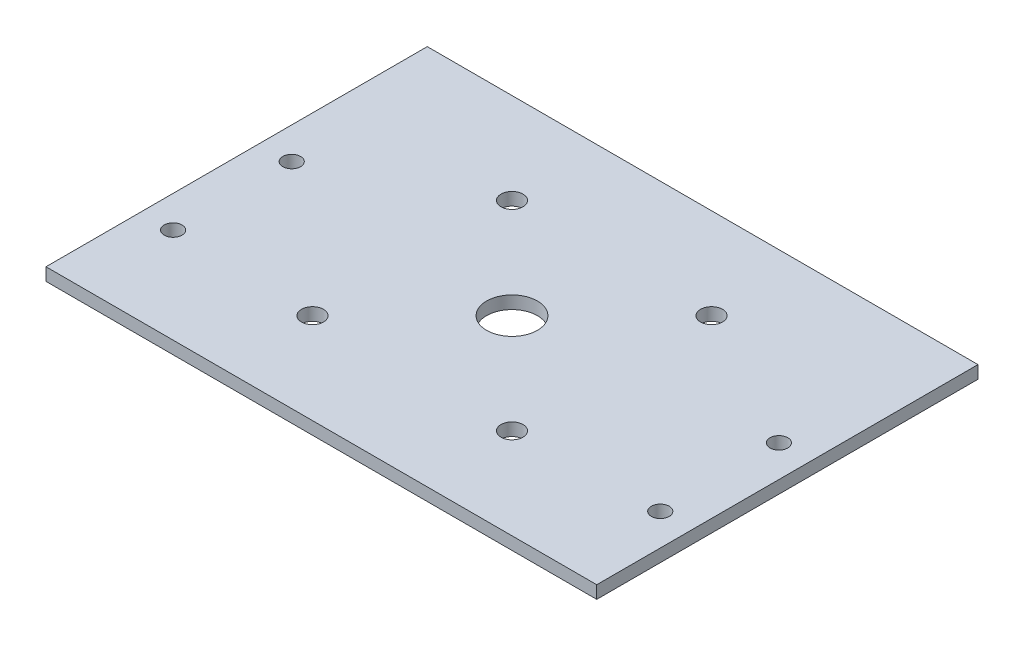
ISO-10303-21;
HEADER;
FILE_DESCRIPTION(('STEP AP214'),'2;1');
FILE_NAME('part.step','',(''),(''),'','','');
FILE_SCHEMA(('AUTOMOTIVE_DESIGN { 1 0 10303 214 1 1 1 1 }'));
ENDSEC;
DATA;
#1=APPLICATION_CONTEXT('core data for automotive mechanical design processes');
#2=APPLICATION_PROTOCOL_DEFINITION('international standard','automotive_design',2000,#1);
#3=PRODUCT_CONTEXT('',#1,'mechanical');
#4=PRODUCT('Part','Part','',(#3));
#5=PRODUCT_RELATED_PRODUCT_CATEGORY('part','',(#4));
#6=PRODUCT_DEFINITION_FORMATION('','',#4);
#7=PRODUCT_DEFINITION_CONTEXT('part definition',#1,'design');
#8=PRODUCT_DEFINITION('design','',#6,#7);
#9=PRODUCT_DEFINITION_SHAPE('','',#8);
#10=(LENGTH_UNIT() NAMED_UNIT(*) SI_UNIT(.MILLI.,.METRE.));
#11=(NAMED_UNIT(*) PLANE_ANGLE_UNIT() SI_UNIT($,.RADIAN.));
#12=(NAMED_UNIT(*) SI_UNIT($,.STERADIAN.) SOLID_ANGLE_UNIT());
#13=UNCERTAINTY_MEASURE_WITH_UNIT(LENGTH_MEASURE(1.E-05),#10,'distance_accuracy_value','');
#14=(GEOMETRIC_REPRESENTATION_CONTEXT(3) GLOBAL_UNCERTAINTY_ASSIGNED_CONTEXT((#13)) GLOBAL_UNIT_ASSIGNED_CONTEXT((#10,
#11,#12)) REPRESENTATION_CONTEXT('',''));
#15=CARTESIAN_POINT('',(0.,0.,0.));
#16=DIRECTION('',(0.,0.,1.));
#17=DIRECTION('',(1.,0.,0.));
#18=AXIS2_PLACEMENT_3D('',#15,#16,#17);
#19=CARTESIAN_POINT('',(65.,3.,-45.));
#20=DIRECTION('',(-1.,0.,0.));
#21=DIRECTION('',(0.,0.,1.));
#22=AXIS2_PLACEMENT_3D('',#19,#20,#21);
#23=PLANE('',#22);
#24=DIRECTION('',(0.,0.,-1.));
#25=VECTOR('',#24,1.);
#26=CARTESIAN_POINT('',(65.,0.,-45.));
#27=LINE('',#26,#25);
#28=CARTESIAN_POINT('',(65.,0.,45.));
#29=VERTEX_POINT('',#28);
#30=CARTESIAN_POINT('',(65.,0.,-45.));
#31=VERTEX_POINT('',#30);
#32=EDGE_CURVE('E111',#29,#31,#27,.T.);
#33=ORIENTED_EDGE('',*,*,#32,.T.);
#34=DIRECTION('',(0.,-1.,0.));
#35=VECTOR('',#34,1.);
#36=CARTESIAN_POINT('',(65.,3.,-45.));
#37=LINE('',#36,#35);
#38=CARTESIAN_POINT('',(65.,3.,-45.));
#39=VERTEX_POINT('',#38);
#40=EDGE_CURVE('E13',#39,#31,#37,.T.);
#41=ORIENTED_EDGE('',*,*,#40,.F.);
#42=DIRECTION('',(0.,0.,-1.));
#43=VECTOR('',#42,1.);
#44=CARTESIAN_POINT('',(65.,3.,-45.));
#45=LINE('',#44,#43);
#46=CARTESIAN_POINT('',(65.,3.,45.));
#47=VERTEX_POINT('',#46);
#48=EDGE_CURVE('E98',#47,#39,#45,.T.);
#49=ORIENTED_EDGE('',*,*,#48,.F.);
#50=DIRECTION('',(0.,-1.,0.));
#51=VECTOR('',#50,1.);
#52=CARTESIAN_POINT('',(65.,3.,45.));
#53=LINE('',#52,#51);
#54=EDGE_CURVE('E107',#47,#29,#53,.T.);
#55=ORIENTED_EDGE('',*,*,#54,.T.);
#56=EDGE_LOOP('',(#33,#41,#49,#55));
#57=FACE_BOUND('',#56,.T.);
#58=ADVANCED_FACE('F45',(#57),#23,.F.);
#59=CARTESIAN_POINT('',(-65.,3.,-45.));
#60=DIRECTION('',(0.,0.,1.));
#61=DIRECTION('',(1.,0.,0.));
#62=AXIS2_PLACEMENT_3D('',#59,#60,#61);
#63=PLANE('',#62);
#64=DIRECTION('',(-1.,0.,0.));
#65=VECTOR('',#64,1.);
#66=CARTESIAN_POINT('',(-65.,0.,-45.));
#67=LINE('',#66,#65);
#68=CARTESIAN_POINT('',(-65.,0.,-45.));
#69=VERTEX_POINT('',#68);
#70=EDGE_CURVE('E102',#31,#69,#67,.T.);
#71=ORIENTED_EDGE('',*,*,#70,.T.);
#72=DIRECTION('',(0.,-1.,0.));
#73=VECTOR('',#72,1.);
#74=CARTESIAN_POINT('',(-65.,3.,-45.));
#75=LINE('',#74,#73);
#76=CARTESIAN_POINT('',(-65.,3.,-45.));
#77=VERTEX_POINT('',#76);
#78=EDGE_CURVE('E54',#77,#69,#75,.T.);
#79=ORIENTED_EDGE('',*,*,#78,.F.);
#80=DIRECTION('',(-1.,0.,0.));
#81=VECTOR('',#80,1.);
#82=CARTESIAN_POINT('',(-65.,3.,-45.));
#83=LINE('',#82,#81);
#84=EDGE_CURVE('E93',#39,#77,#83,.T.);
#85=ORIENTED_EDGE('',*,*,#84,.F.);
#86=ORIENTED_EDGE('',*,*,#40,.T.);
#87=EDGE_LOOP('',(#71,#79,#85,#86));
#88=FACE_BOUND('',#87,.T.);
#89=ADVANCED_FACE('F101',(#88),#63,.F.);
#90=CARTESIAN_POINT('',(-65.,3.,-45.));
#91=DIRECTION('',(1.,0.,0.));
#92=DIRECTION('',(0.,0.,-1.));
#93=AXIS2_PLACEMENT_3D('',#90,#91,#92);
#94=PLANE('',#93);
#95=DIRECTION('',(0.,0.,1.));
#96=VECTOR('',#95,1.);
#97=CARTESIAN_POINT('',(-65.,0.,-45.));
#98=LINE('',#97,#96);
#99=CARTESIAN_POINT('',(-65.,0.,45.));
#100=VERTEX_POINT('',#99);
#101=EDGE_CURVE('E80',#69,#100,#98,.T.);
#102=ORIENTED_EDGE('',*,*,#101,.T.);
#103=DIRECTION('',(0.,-1.,0.));
#104=VECTOR('',#103,1.);
#105=CARTESIAN_POINT('',(-65.,3.,45.));
#106=LINE('',#105,#104);
#107=CARTESIAN_POINT('',(-65.,3.,45.));
#108=VERTEX_POINT('',#107);
#109=EDGE_CURVE('E103',#108,#100,#106,.T.);
#110=ORIENTED_EDGE('',*,*,#109,.F.);
#111=DIRECTION('',(0.,0.,1.));
#112=VECTOR('',#111,1.);
#113=CARTESIAN_POINT('',(-65.,3.,-45.));
#114=LINE('',#113,#112);
#115=EDGE_CURVE('E96',#77,#108,#114,.T.);
#116=ORIENTED_EDGE('',*,*,#115,.F.);
#117=ORIENTED_EDGE('',*,*,#78,.T.);
#118=EDGE_LOOP('',(#102,#110,#116,#117));
#119=FACE_BOUND('',#118,.T.);
#120=ADVANCED_FACE('F105',(#119),#94,.F.);
#121=CARTESIAN_POINT('',(-65.,3.,45.));
#122=DIRECTION('',(0.,0.,-1.));
#123=DIRECTION('',(-1.,0.,0.));
#124=AXIS2_PLACEMENT_3D('',#121,#122,#123);
#125=PLANE('',#124);
#126=DIRECTION('',(1.,0.,0.));
#127=VECTOR('',#126,1.);
#128=CARTESIAN_POINT('',(-65.,0.,45.));
#129=LINE('',#128,#127);
#130=EDGE_CURVE('E86',#100,#29,#129,.T.);
#131=ORIENTED_EDGE('',*,*,#130,.T.);
#132=ORIENTED_EDGE('',*,*,#54,.F.);
#133=DIRECTION('',(1.,0.,0.));
#134=VECTOR('',#133,1.);
#135=CARTESIAN_POINT('',(-65.,3.,45.));
#136=LINE('',#135,#134);
#137=EDGE_CURVE('E63',#108,#47,#136,.T.);
#138=ORIENTED_EDGE('',*,*,#137,.F.);
#139=ORIENTED_EDGE('',*,*,#109,.T.);
#140=EDGE_LOOP('',(#131,#132,#138,#139));
#141=FACE_BOUND('',#140,.T.);
#142=ADVANCED_FACE('F150',(#141),#125,.F.);
#143=CARTESIAN_POINT('',(0.,3.,0.));
#144=DIRECTION('',(0.,1.,0.));
#145=DIRECTION('',(0.,0.,1.));
#146=AXIS2_PLACEMENT_3D('',#143,#144,#145);
#147=PLANE('',#146);
#148=CARTESIAN_POINT('',(0.,3.,0.));
#149=DIRECTION('',(0.,1.,0.));
#150=DIRECTION('',(0.,0.,1.));
#151=AXIS2_PLACEMENT_3D('',#148,#149,#150);
#152=CIRCLE('',#151,6.);
#153=CARTESIAN_POINT('',(0.,3.,6.));
#154=VERTEX_POINT('',#153);
#155=EDGE_CURVE('E282',#154,#154,#152,.T.);
#156=ORIENTED_EDGE('',*,*,#155,.F.);
#157=EDGE_LOOP('',(#156));
#158=FACE_BOUND('',#157,.T.);
#159=CARTESIAN_POINT('',(57.5,3.,-5.50000000000005));
#160=DIRECTION('',(0.,1.,0.));
#161=DIRECTION('',(0.,0.,1.));
#162=AXIS2_PLACEMENT_3D('',#159,#160,#161);
#163=CIRCLE('',#162,2.1);
#164=CARTESIAN_POINT('',(57.5,3.,-3.40000000000005));
#165=VERTEX_POINT('',#164);
#166=EDGE_CURVE('E292',#165,#165,#163,.T.);
#167=ORIENTED_EDGE('',*,*,#166,.F.);
#168=EDGE_LOOP('',(#167));
#169=FACE_BOUND('',#168,.T.);
#170=CARTESIAN_POINT('',(-57.5,3.,-5.50000000000005));
#171=DIRECTION('',(0.,1.,0.));
#172=DIRECTION('',(0.,0.,1.));
#173=AXIS2_PLACEMENT_3D('',#170,#171,#172);
#174=CIRCLE('',#173,2.1);
#175=CARTESIAN_POINT('',(-57.5,3.,-3.40000000000005));
#176=VERTEX_POINT('',#175);
#177=EDGE_CURVE('E298',#176,#176,#174,.T.);
#178=ORIENTED_EDGE('',*,*,#177,.F.);
#179=EDGE_LOOP('',(#178));
#180=FACE_BOUND('',#179,.T.);
#181=CARTESIAN_POINT('',(-57.5,3.,22.4999999999995));
#182=DIRECTION('',(0.,1.,0.));
#183=DIRECTION('',(0.,0.,1.));
#184=AXIS2_PLACEMENT_3D('',#181,#182,#183);
#185=CIRCLE('',#184,2.1);
#186=CARTESIAN_POINT('',(-57.5,3.,24.5999999999995));
#187=VERTEX_POINT('',#186);
#188=EDGE_CURVE('E304',#187,#187,#185,.T.);
#189=ORIENTED_EDGE('',*,*,#188,.F.);
#190=EDGE_LOOP('',(#189));
#191=FACE_BOUND('',#190,.T.);
#192=CARTESIAN_POINT('',(57.5,3.,22.4999999999995));
#193=DIRECTION('',(0.,1.,0.));
#194=DIRECTION('',(0.,0.,1.));
#195=AXIS2_PLACEMENT_3D('',#192,#193,#194);
#196=CIRCLE('',#195,2.1);
#197=CARTESIAN_POINT('',(57.5,3.,24.5999999999995));
#198=VERTEX_POINT('',#197);
#199=EDGE_CURVE('E309',#198,#198,#196,.T.);
#200=ORIENTED_EDGE('',*,*,#199,.F.);
#201=EDGE_LOOP('',(#200));
#202=FACE_BOUND('',#201,.T.);
#203=CARTESIAN_POINT('',(23.55,3.,-23.55));
#204=DIRECTION('',(0.,1.,0.));
#205=DIRECTION('',(0.,0.,1.));
#206=AXIS2_PLACEMENT_3D('',#203,#204,#205);
#207=CIRCLE('',#206,2.6);
#208=CARTESIAN_POINT('',(23.55,3.,-20.95));
#209=VERTEX_POINT('',#208);
#210=EDGE_CURVE('E138',#209,#209,#207,.T.);
#211=ORIENTED_EDGE('',*,*,#210,.F.);
#212=EDGE_LOOP('',(#211));
#213=FACE_BOUND('',#212,.T.);
#214=CARTESIAN_POINT('',(-23.55,3.,-23.55));
#215=DIRECTION('',(0.,1.,0.));
#216=DIRECTION('',(0.,0.,1.));
#217=AXIS2_PLACEMENT_3D('',#214,#215,#216);
#218=CIRCLE('',#217,2.6);
#219=CARTESIAN_POINT('',(-23.55,3.,-20.95));
#220=VERTEX_POINT('',#219);
#221=EDGE_CURVE('E128',#220,#220,#218,.T.);
#222=ORIENTED_EDGE('',*,*,#221,.F.);
#223=EDGE_LOOP('',(#222));
#224=FACE_BOUND('',#223,.T.);
#225=CARTESIAN_POINT('',(-23.55,3.,23.55));
#226=DIRECTION('',(0.,1.,0.));
#227=DIRECTION('',(0.,0.,1.));
#228=AXIS2_PLACEMENT_3D('',#225,#226,#227);
#229=CIRCLE('',#228,2.6);
#230=CARTESIAN_POINT('',(-23.55,3.,26.15));
#231=VERTEX_POINT('',#230);
#232=EDGE_CURVE('E125',#231,#231,#229,.T.);
#233=ORIENTED_EDGE('',*,*,#232,.F.);
#234=EDGE_LOOP('',(#233));
#235=FACE_BOUND('',#234,.T.);
#236=CARTESIAN_POINT('',(23.55,3.,23.55));
#237=DIRECTION('',(0.,1.,0.));
#238=DIRECTION('',(0.,0.,1.));
#239=AXIS2_PLACEMENT_3D('',#236,#237,#238);
#240=CIRCLE('',#239,2.6);
#241=CARTESIAN_POINT('',(23.55,3.,26.15));
#242=VERTEX_POINT('',#241);
#243=EDGE_CURVE('E122',#242,#242,#240,.T.);
#244=ORIENTED_EDGE('',*,*,#243,.F.);
#245=EDGE_LOOP('',(#244));
#246=FACE_BOUND('',#245,.T.);
#247=ORIENTED_EDGE('',*,*,#48,.T.);
#248=ORIENTED_EDGE('',*,*,#84,.T.);
#249=ORIENTED_EDGE('',*,*,#115,.T.);
#250=ORIENTED_EDGE('',*,*,#137,.T.);
#251=EDGE_LOOP('',(#247,#248,#249,#250));
#252=FACE_BOUND('',#251,.T.);
#253=ADVANCED_FACE('F94',(#158,#169,#180,#191,#202,#213,#224,#235,#246,#252),#147,.T.);
#254=CARTESIAN_POINT('',(0.,0.,0.));
#255=DIRECTION('',(0.,1.,0.));
#256=DIRECTION('',(0.,0.,1.));
#257=AXIS2_PLACEMENT_3D('',#254,#255,#256);
#258=PLANE('',#257);
#259=CARTESIAN_POINT('',(0.,0.,0.));
#260=DIRECTION('',(0.,-1.,0.));
#261=DIRECTION('',(0.,0.,-1.));
#262=AXIS2_PLACEMENT_3D('',#259,#260,#261);
#263=CIRCLE('',#262,6.);
#264=CARTESIAN_POINT('',(0.,0.,-6.));
#265=VERTEX_POINT('',#264);
#266=EDGE_CURVE('E285',#265,#265,#263,.T.);
#267=ORIENTED_EDGE('',*,*,#266,.F.);
#268=EDGE_LOOP('',(#267));
#269=FACE_BOUND('',#268,.T.);
#270=CARTESIAN_POINT('',(57.5,0.,-5.50000000000005));
#271=DIRECTION('',(0.,-1.,0.));
#272=DIRECTION('',(0.,0.,-1.));
#273=AXIS2_PLACEMENT_3D('',#270,#271,#272);
#274=CIRCLE('',#273,2.1);
#275=CARTESIAN_POINT('',(57.5,0.,-7.60000000000004));
#276=VERTEX_POINT('',#275);
#277=EDGE_CURVE('E287',#276,#276,#274,.T.);
#278=ORIENTED_EDGE('',*,*,#277,.F.);
#279=EDGE_LOOP('',(#278));
#280=FACE_BOUND('',#279,.T.);
#281=CARTESIAN_POINT('',(-57.5,0.,-5.50000000000005));
#282=DIRECTION('',(0.,-1.,0.));
#283=DIRECTION('',(0.,0.,-1.));
#284=AXIS2_PLACEMENT_3D('',#281,#282,#283);
#285=CIRCLE('',#284,2.1);
#286=CARTESIAN_POINT('',(-57.5,0.,-7.60000000000004));
#287=VERTEX_POINT('',#286);
#288=EDGE_CURVE('E295',#287,#287,#285,.T.);
#289=ORIENTED_EDGE('',*,*,#288,.F.);
#290=EDGE_LOOP('',(#289));
#291=FACE_BOUND('',#290,.T.);
#292=CARTESIAN_POINT('',(-57.5,0.,22.4999999999995));
#293=DIRECTION('',(0.,-1.,0.));
#294=DIRECTION('',(0.,0.,-1.));
#295=AXIS2_PLACEMENT_3D('',#292,#293,#294);
#296=CIRCLE('',#295,2.1);
#297=CARTESIAN_POINT('',(-57.5,0.,20.3999999999995));
#298=VERTEX_POINT('',#297);
#299=EDGE_CURVE('E301',#298,#298,#296,.T.);
#300=ORIENTED_EDGE('',*,*,#299,.F.);
#301=EDGE_LOOP('',(#300));
#302=FACE_BOUND('',#301,.T.);
#303=CARTESIAN_POINT('',(57.5,0.,22.4999999999995));
#304=DIRECTION('',(0.,-1.,0.));
#305=DIRECTION('',(0.,0.,-1.));
#306=AXIS2_PLACEMENT_3D('',#303,#304,#305);
#307=CIRCLE('',#306,2.1);
#308=CARTESIAN_POINT('',(57.5,0.,20.3999999999995));
#309=VERTEX_POINT('',#308);
#310=EDGE_CURVE('E307',#309,#309,#307,.T.);
#311=ORIENTED_EDGE('',*,*,#310,.F.);
#312=EDGE_LOOP('',(#311));
#313=FACE_BOUND('',#312,.T.);
#314=CARTESIAN_POINT('',(23.55,0.,-23.55));
#315=DIRECTION('',(0.,1.,0.));
#316=DIRECTION('',(0.,0.,1.));
#317=AXIS2_PLACEMENT_3D('',#314,#315,#316);
#318=CIRCLE('',#317,2.6);
#319=CARTESIAN_POINT('',(23.55,0.,-20.95));
#320=VERTEX_POINT('',#319);
#321=EDGE_CURVE('E48',#320,#320,#318,.T.);
#322=ORIENTED_EDGE('',*,*,#321,.T.);
#323=EDGE_LOOP('',(#322));
#324=FACE_BOUND('',#323,.T.);
#325=CARTESIAN_POINT('',(-23.55,0.,-23.55));
#326=DIRECTION('',(0.,1.,0.));
#327=DIRECTION('',(0.,0.,1.));
#328=AXIS2_PLACEMENT_3D('',#325,#326,#327);
#329=CIRCLE('',#328,2.6);
#330=CARTESIAN_POINT('',(-23.55,0.,-20.95));
#331=VERTEX_POINT('',#330);
#332=EDGE_CURVE('E126',#331,#331,#329,.T.);
#333=ORIENTED_EDGE('',*,*,#332,.T.);
#334=EDGE_LOOP('',(#333));
#335=FACE_BOUND('',#334,.T.);
#336=CARTESIAN_POINT('',(-23.55,0.,23.55));
#337=DIRECTION('',(0.,1.,0.));
#338=DIRECTION('',(0.,0.,1.));
#339=AXIS2_PLACEMENT_3D('',#336,#337,#338);
#340=CIRCLE('',#339,2.6);
#341=CARTESIAN_POINT('',(-23.55,0.,26.15));
#342=VERTEX_POINT('',#341);
#343=EDGE_CURVE('E123',#342,#342,#340,.T.);
#344=ORIENTED_EDGE('',*,*,#343,.T.);
#345=EDGE_LOOP('',(#344));
#346=FACE_BOUND('',#345,.T.);
#347=CARTESIAN_POINT('',(23.55,0.,23.55));
#348=DIRECTION('',(0.,1.,0.));
#349=DIRECTION('',(0.,0.,1.));
#350=AXIS2_PLACEMENT_3D('',#347,#348,#349);
#351=CIRCLE('',#350,2.6);
#352=CARTESIAN_POINT('',(23.55,0.,26.15));
#353=VERTEX_POINT('',#352);
#354=EDGE_CURVE('E114',#353,#353,#351,.T.);
#355=ORIENTED_EDGE('',*,*,#354,.T.);
#356=EDGE_LOOP('',(#355));
#357=FACE_BOUND('',#356,.T.);
#358=ORIENTED_EDGE('',*,*,#32,.F.);
#359=ORIENTED_EDGE('',*,*,#130,.F.);
#360=ORIENTED_EDGE('',*,*,#101,.F.);
#361=ORIENTED_EDGE('',*,*,#70,.F.);
#362=EDGE_LOOP('',(#358,#359,#360,#361));
#363=FACE_BOUND('',#362,.T.);
#364=ADVANCED_FACE('F149',(#269,#280,#291,#302,#313,#324,#335,#346,#357,#363),#258,.F.);
#365=CARTESIAN_POINT('',(23.55,-7.,23.55));
#366=DIRECTION('',(0.,1.,0.));
#367=DIRECTION('',(0.,0.,1.));
#368=AXIS2_PLACEMENT_3D('',#365,#366,#367);
#369=CYLINDRICAL_SURFACE('',#368,2.6);
#370=ORIENTED_EDGE('',*,*,#243,.T.);
#371=EDGE_LOOP('',(#370));
#372=FACE_BOUND('',#371,.T.);
#373=ORIENTED_EDGE('',*,*,#354,.F.);
#374=EDGE_LOOP('',(#373));
#375=FACE_BOUND('',#374,.T.);
#376=ADVANCED_FACE('F145',(#372,#375),#369,.F.);
#377=CARTESIAN_POINT('',(-23.55,-7.,23.55));
#378=DIRECTION('',(0.,1.,0.));
#379=DIRECTION('',(0.,0.,1.));
#380=AXIS2_PLACEMENT_3D('',#377,#378,#379);
#381=CYLINDRICAL_SURFACE('',#380,2.6);
#382=ORIENTED_EDGE('',*,*,#232,.T.);
#383=EDGE_LOOP('',(#382));
#384=FACE_BOUND('',#383,.T.);
#385=ORIENTED_EDGE('',*,*,#343,.F.);
#386=EDGE_LOOP('',(#385));
#387=FACE_BOUND('',#386,.T.);
#388=ADVANCED_FACE('F190',(#384,#387),#381,.F.);
#389=CARTESIAN_POINT('',(-23.55,-7.,-23.55));
#390=DIRECTION('',(0.,1.,0.));
#391=DIRECTION('',(0.,0.,1.));
#392=AXIS2_PLACEMENT_3D('',#389,#390,#391);
#393=CYLINDRICAL_SURFACE('',#392,2.6);
#394=ORIENTED_EDGE('',*,*,#221,.T.);
#395=EDGE_LOOP('',(#394));
#396=FACE_BOUND('',#395,.T.);
#397=ORIENTED_EDGE('',*,*,#332,.F.);
#398=EDGE_LOOP('',(#397));
#399=FACE_BOUND('',#398,.T.);
#400=ADVANCED_FACE('F199',(#396,#399),#393,.F.);
#401=CARTESIAN_POINT('',(23.55,-7.,-23.55));
#402=DIRECTION('',(0.,1.,0.));
#403=DIRECTION('',(0.,0.,1.));
#404=AXIS2_PLACEMENT_3D('',#401,#402,#403);
#405=CYLINDRICAL_SURFACE('',#404,2.6);
#406=ORIENTED_EDGE('',*,*,#210,.T.);
#407=EDGE_LOOP('',(#406));
#408=FACE_BOUND('',#407,.T.);
#409=ORIENTED_EDGE('',*,*,#321,.F.);
#410=EDGE_LOOP('',(#409));
#411=FACE_BOUND('',#410,.T.);
#412=ADVANCED_FACE('F209',(#408,#411),#405,.F.);
#413=CARTESIAN_POINT('',(57.5,10.,22.4999999999995));
#414=DIRECTION('',(0.,-1.,0.));
#415=DIRECTION('',(0.,0.,-1.));
#416=AXIS2_PLACEMENT_3D('',#413,#414,#415);
#417=CYLINDRICAL_SURFACE('',#416,2.1);
#418=ORIENTED_EDGE('',*,*,#199,.T.);
#419=EDGE_LOOP('',(#418));
#420=FACE_BOUND('',#419,.T.);
#421=ORIENTED_EDGE('',*,*,#310,.T.);
#422=EDGE_LOOP('',(#421));
#423=FACE_BOUND('',#422,.T.);
#424=ADVANCED_FACE('F218',(#420,#423),#417,.F.);
#425=CARTESIAN_POINT('',(-57.5,10.,22.4999999999995));
#426=DIRECTION('',(0.,-1.,0.));
#427=DIRECTION('',(0.,0.,-1.));
#428=AXIS2_PLACEMENT_3D('',#425,#426,#427);
#429=CYLINDRICAL_SURFACE('',#428,2.1);
#430=ORIENTED_EDGE('',*,*,#188,.T.);
#431=EDGE_LOOP('',(#430));
#432=FACE_BOUND('',#431,.T.);
#433=ORIENTED_EDGE('',*,*,#299,.T.);
#434=EDGE_LOOP('',(#433));
#435=FACE_BOUND('',#434,.T.);
#436=ADVANCED_FACE('F228',(#432,#435),#429,.F.);
#437=CARTESIAN_POINT('',(-57.5,10.,-5.50000000000005));
#438=DIRECTION('',(0.,-1.,0.));
#439=DIRECTION('',(0.,0.,-1.));
#440=AXIS2_PLACEMENT_3D('',#437,#438,#439);
#441=CYLINDRICAL_SURFACE('',#440,2.1);
#442=ORIENTED_EDGE('',*,*,#177,.T.);
#443=EDGE_LOOP('',(#442));
#444=FACE_BOUND('',#443,.T.);
#445=ORIENTED_EDGE('',*,*,#288,.T.);
#446=EDGE_LOOP('',(#445));
#447=FACE_BOUND('',#446,.T.);
#448=ADVANCED_FACE('F238',(#444,#447),#441,.F.);
#449=CARTESIAN_POINT('',(57.5,10.,-5.50000000000005));
#450=DIRECTION('',(0.,-1.,0.));
#451=DIRECTION('',(0.,0.,-1.));
#452=AXIS2_PLACEMENT_3D('',#449,#450,#451);
#453=CYLINDRICAL_SURFACE('',#452,2.1);
#454=ORIENTED_EDGE('',*,*,#166,.T.);
#455=EDGE_LOOP('',(#454));
#456=FACE_BOUND('',#455,.T.);
#457=ORIENTED_EDGE('',*,*,#277,.T.);
#458=EDGE_LOOP('',(#457));
#459=FACE_BOUND('',#458,.T.);
#460=ADVANCED_FACE('F248',(#456,#459),#453,.F.);
#461=CARTESIAN_POINT('',(0.,10.,0.));
#462=DIRECTION('',(0.,-1.,0.));
#463=DIRECTION('',(0.,0.,-1.));
#464=AXIS2_PLACEMENT_3D('',#461,#462,#463);
#465=CYLINDRICAL_SURFACE('',#464,6.);
#466=ORIENTED_EDGE('',*,*,#155,.T.);
#467=EDGE_LOOP('',(#466));
#468=FACE_BOUND('',#467,.T.);
#469=ORIENTED_EDGE('',*,*,#266,.T.);
#470=EDGE_LOOP('',(#469));
#471=FACE_BOUND('',#470,.T.);
#472=ADVANCED_FACE('F257',(#468,#471),#465,.F.);
#473=CLOSED_SHELL('',(#58,#89,#120,#142,#253,#364,#376,#388,#400,#412,#424,#436,#448,#460,#472));
#474=MANIFOLD_SOLID_BREP('B2',#473);
#475=ADVANCED_BREP_SHAPE_REPRESENTATION('',(#18,#474),#14);
#476=SHAPE_DEFINITION_REPRESENTATION(#9,#475);
ENDSEC;
END-ISO-10303-21;
